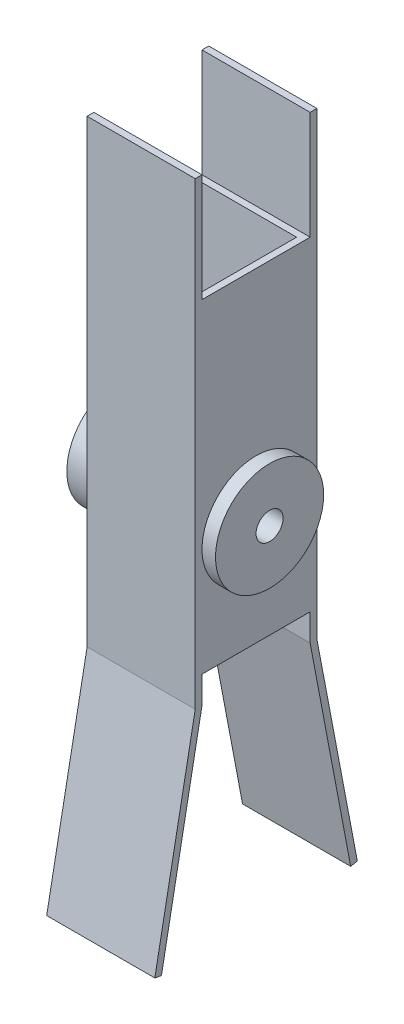
ISO-10303-21;
HEADER;
FILE_DESCRIPTION(('STEP AP214'),'2;1');
FILE_NAME('part.step','',(''),(''),'','','');
FILE_SCHEMA(('AUTOMOTIVE_DESIGN { 1 0 10303 214 1 1 1 1 }'));
ENDSEC;
DATA;
#1=APPLICATION_CONTEXT('core data for automotive mechanical design processes');
#2=APPLICATION_PROTOCOL_DEFINITION('international standard','automotive_design',2000,#1);
#3=PRODUCT_CONTEXT('',#1,'mechanical');
#4=PRODUCT('Part','Part','',(#3));
#5=PRODUCT_RELATED_PRODUCT_CATEGORY('part','',(#4));
#6=PRODUCT_DEFINITION_FORMATION('','',#4);
#7=PRODUCT_DEFINITION_CONTEXT('part definition',#1,'design');
#8=PRODUCT_DEFINITION('design','',#6,#7);
#9=PRODUCT_DEFINITION_SHAPE('','',#8);
#10=(LENGTH_UNIT() NAMED_UNIT(*) SI_UNIT(.MILLI.,.METRE.));
#11=(NAMED_UNIT(*) PLANE_ANGLE_UNIT() SI_UNIT($,.RADIAN.));
#12=(NAMED_UNIT(*) SI_UNIT($,.STERADIAN.) SOLID_ANGLE_UNIT());
#13=UNCERTAINTY_MEASURE_WITH_UNIT(LENGTH_MEASURE(1.E-05),#10,'distance_accuracy_value','');
#14=(GEOMETRIC_REPRESENTATION_CONTEXT(3) GLOBAL_UNCERTAINTY_ASSIGNED_CONTEXT((#13)) GLOBAL_UNIT_ASSIGNED_CONTEXT((#10,
#11,#12)) REPRESENTATION_CONTEXT('',''));
#15=CARTESIAN_POINT('',(0.,0.,0.));
#16=DIRECTION('',(0.,0.,1.));
#17=DIRECTION('',(1.,0.,0.));
#18=AXIS2_PLACEMENT_3D('',#15,#16,#17);
#19=CARTESIAN_POINT('',(1.5875,-94.6502778847388,11.1125));
#20=DIRECTION('',(-1.,0.,0.));
#21=DIRECTION('',(0.,0.,1.));
#22=AXIS2_PLACEMENT_3D('',#19,#20,#21);
#23=PLANE('',#22);
#24=DIRECTION('',(0.,1.,0.));
#25=VECTOR('',#24,1.);
#26=CARTESIAN_POINT('',(1.5875,-94.6502778847388,11.1125));
#27=LINE('',#26,#25);
#28=CARTESIAN_POINT('',(1.5875,-6.55163893789573,11.1125));
#29=VERTEX_POINT('',#28);
#30=CARTESIAN_POINT('',(1.5875,38.1,11.1125));
#31=VERTEX_POINT('',#30);
#32=EDGE_CURVE('E222',#29,#31,#27,.T.);
#33=ORIENTED_EDGE('',*,*,#32,.F.);
#34=CARTESIAN_POINT('',(1.5875,-12.7,0.));
#35=DIRECTION('',(-1.,0.,0.));
#36=DIRECTION('',(0.,0.,1.));
#37=AXIS2_PLACEMENT_3D('',#34,#35,#36);
#38=CIRCLE('',#37,12.7);
#39=CARTESIAN_POINT('',(1.5875,-6.55163893789573,-11.1125));
#40=VERTEX_POINT('',#39);
#41=EDGE_CURVE('E59',#29,#40,#38,.T.);
#42=ORIENTED_EDGE('',*,*,#41,.T.);
#43=DIRECTION('',(0.,1.,0.));
#44=VECTOR('',#43,1.);
#45=CARTESIAN_POINT('',(1.5875,-94.6502778847388,-11.1125));
#46=LINE('',#45,#44);
#47=CARTESIAN_POINT('',(1.5875,38.1,-11.1125));
#48=VERTEX_POINT('',#47);
#49=EDGE_CURVE('E467',#40,#48,#46,.T.);
#50=ORIENTED_EDGE('',*,*,#49,.T.);
#51=DIRECTION('',(0.,0.,1.));
#52=VECTOR('',#51,1.);
#53=CARTESIAN_POINT('',(1.5875,38.1,11.1125));
#54=LINE('',#53,#52);
#55=EDGE_CURVE('E475',#48,#31,#54,.T.);
#56=ORIENTED_EDGE('',*,*,#55,.T.);
#57=EDGE_LOOP('',(#33,#42,#50,#56));
#58=FACE_BOUND('',#57,.T.);
#59=ADVANCED_FACE('F35',(#58),#23,.F.);
#60=CARTESIAN_POINT('',(23.8125,-94.6502778847388,-11.1125));
#61=DIRECTION('',(0.,0.,-1.));
#62=DIRECTION('',(-1.,0.,0.));
#63=AXIS2_PLACEMENT_3D('',#60,#61,#62);
#64=PLANE('',#63);
#65=ORIENTED_EDGE('',*,*,#49,.F.);
#66=DIRECTION('',(1.,0.,0.));
#67=VECTOR('',#66,1.);
#68=CARTESIAN_POINT('',(-6.35,-6.55163893789573,-11.1125));
#69=LINE('',#68,#67);
#70=CARTESIAN_POINT('',(23.8125,-6.55163893789573,-11.1125));
#71=VERTEX_POINT('',#70);
#72=EDGE_CURVE('E210',#40,#71,#69,.T.);
#73=ORIENTED_EDGE('',*,*,#72,.T.);
#74=DIRECTION('',(0.,1.,0.));
#75=VECTOR('',#74,1.);
#76=CARTESIAN_POINT('',(23.8125,-94.6502778847388,-11.1125));
#77=LINE('',#76,#75);
#78=CARTESIAN_POINT('',(23.8125,38.1,-11.1125));
#79=VERTEX_POINT('',#78);
#80=EDGE_CURVE('E209',#71,#79,#77,.T.);
#81=ORIENTED_EDGE('',*,*,#80,.T.);
#82=DIRECTION('',(-1.,0.,0.));
#83=VECTOR('',#82,1.);
#84=CARTESIAN_POINT('',(23.8125,38.1,-11.1125));
#85=LINE('',#84,#83);
#86=EDGE_CURVE('E469',#79,#48,#85,.T.);
#87=ORIENTED_EDGE('',*,*,#86,.T.);
#88=EDGE_LOOP('',(#65,#73,#81,#87));
#89=FACE_BOUND('',#88,.T.);
#90=ADVANCED_FACE('F439',(#89),#64,.F.);
#91=CARTESIAN_POINT('',(23.8125,-94.6502778847388,11.1125));
#92=DIRECTION('',(1.,0.,0.));
#93=DIRECTION('',(0.,0.,-1.));
#94=AXIS2_PLACEMENT_3D('',#91,#92,#93);
#95=PLANE('',#94);
#96=ORIENTED_EDGE('',*,*,#80,.F.);
#97=CARTESIAN_POINT('',(23.8125,-12.7,0.));
#98=DIRECTION('',(1.,0.,0.));
#99=DIRECTION('',(0.,0.,-1.));
#100=AXIS2_PLACEMENT_3D('',#97,#98,#99);
#101=CIRCLE('',#100,12.7);
#102=CARTESIAN_POINT('',(23.8125,-6.55163893789574,11.1125));
#103=VERTEX_POINT('',#102);
#104=EDGE_CURVE('E197',#71,#103,#101,.T.);
#105=ORIENTED_EDGE('',*,*,#104,.T.);
#106=DIRECTION('',(0.,1.,0.));
#107=VECTOR('',#106,1.);
#108=CARTESIAN_POINT('',(23.8125,-94.6502778847388,11.1125));
#109=LINE('',#108,#107);
#110=CARTESIAN_POINT('',(23.8125,38.1,11.1125));
#111=VERTEX_POINT('',#110);
#112=EDGE_CURVE('E207',#103,#111,#109,.T.);
#113=ORIENTED_EDGE('',*,*,#112,.T.);
#114=DIRECTION('',(0.,0.,-1.));
#115=VECTOR('',#114,1.);
#116=CARTESIAN_POINT('',(23.8125,38.1,11.1125));
#117=LINE('',#116,#115);
#118=EDGE_CURVE('E472',#111,#79,#117,.T.);
#119=ORIENTED_EDGE('',*,*,#118,.T.);
#120=EDGE_LOOP('',(#96,#105,#113,#119));
#121=FACE_BOUND('',#120,.T.);
#122=ADVANCED_FACE('F205',(#121),#95,.F.);
#123=CARTESIAN_POINT('',(23.8125,-94.6502778847388,11.1125));
#124=DIRECTION('',(0.,0.,1.));
#125=DIRECTION('',(1.,0.,0.));
#126=AXIS2_PLACEMENT_3D('',#123,#124,#125);
#127=PLANE('',#126);
#128=CARTESIAN_POINT('',(1.5875,-38.1,11.1125));
#129=VERTEX_POINT('',#128);
#130=CARTESIAN_POINT('',(1.5875,-18.8483610621043,11.1125));
#131=VERTEX_POINT('',#130);
#132=EDGE_CURVE('E218',#129,#131,#27,.T.);
#133=ORIENTED_EDGE('',*,*,#132,.T.);
#134=DIRECTION('',(1.,0.,0.));
#135=VECTOR('',#134,1.);
#136=CARTESIAN_POINT('',(-6.35,-18.8483610621043,11.1125));
#137=LINE('',#136,#135);
#138=CARTESIAN_POINT('',(23.8125,-18.8483610621042,11.1125));
#139=VERTEX_POINT('',#138);
#140=EDGE_CURVE('E39',#131,#139,#137,.T.);
#141=ORIENTED_EDGE('',*,*,#140,.T.);
#142=CARTESIAN_POINT('',(23.8125,-38.1,11.1125));
#143=VERTEX_POINT('',#142);
#144=EDGE_CURVE('E217',#143,#139,#109,.T.);
#145=ORIENTED_EDGE('',*,*,#144,.F.);
#146=DIRECTION('',(1.,0.,0.));
#147=VECTOR('',#146,1.);
#148=CARTESIAN_POINT('',(25.4,-38.1,11.1125));
#149=LINE('',#148,#147);
#150=EDGE_CURVE('E228',#129,#143,#149,.T.);
#151=ORIENTED_EDGE('',*,*,#150,.F.);
#152=EDGE_LOOP('',(#133,#141,#145,#151));
#153=FACE_BOUND('',#152,.T.);
#154=ADVANCED_FACE('F528',(#153),#127,.F.);
#155=CARTESIAN_POINT('',(25.4,-38.1,0.));
#156=DIRECTION('',(0.,1.,0.));
#157=DIRECTION('',(0.,0.,1.));
#158=AXIS2_PLACEMENT_3D('',#155,#156,#157);
#159=PLANE('',#158);
#160=DIRECTION('',(-1.,0.,0.));
#161=VECTOR('',#160,1.);
#162=CARTESIAN_POINT('',(25.4,-38.1,-11.1125));
#163=LINE('',#162,#161);
#164=CARTESIAN_POINT('',(23.8125,-38.1,-11.1125));
#165=VERTEX_POINT('',#164);
#166=CARTESIAN_POINT('',(1.5875,-38.1,-11.1125));
#167=VERTEX_POINT('',#166);
#168=EDGE_CURVE('E235',#165,#167,#163,.T.);
#169=ORIENTED_EDGE('',*,*,#168,.T.);
#170=DIRECTION('',(0.,0.,1.));
#171=VECTOR('',#170,1.);
#172=CARTESIAN_POINT('',(1.5875,-38.1,0.));
#173=LINE('',#172,#171);
#174=EDGE_CURVE('E238',#167,#129,#173,.T.);
#175=ORIENTED_EDGE('',*,*,#174,.T.);
#176=ORIENTED_EDGE('',*,*,#150,.T.);
#177=DIRECTION('',(0.,0.,-1.));
#178=VECTOR('',#177,1.);
#179=CARTESIAN_POINT('',(23.8125,-38.1,0.));
#180=LINE('',#179,#178);
#181=EDGE_CURVE('E231',#143,#165,#180,.T.);
#182=ORIENTED_EDGE('',*,*,#181,.T.);
#183=EDGE_LOOP('',(#169,#175,#176,#182));
#184=FACE_BOUND('',#183,.T.);
#185=DIRECTION('',(0.,0.,-1.));
#186=VECTOR('',#185,1.);
#187=CARTESIAN_POINT('',(0.,-38.1,0.));
#188=LINE('',#187,#186);
#189=CARTESIAN_POINT('',(0.,-38.1,12.7));
#190=VERTEX_POINT('',#189);
#191=CARTESIAN_POINT('',(0.,-38.1,-12.7));
#192=VERTEX_POINT('',#191);
#193=EDGE_CURVE('E241',#190,#192,#188,.T.);
#194=ORIENTED_EDGE('',*,*,#193,.T.);
#195=DIRECTION('',(-1.,0.,0.));
#196=VECTOR('',#195,1.);
#197=CARTESIAN_POINT('',(25.4,-38.1,-12.7));
#198=LINE('',#197,#196);
#199=CARTESIAN_POINT('',(25.4,-38.1,-12.7));
#200=VERTEX_POINT('',#199);
#201=EDGE_CURVE('E202',#200,#192,#198,.T.);
#202=ORIENTED_EDGE('',*,*,#201,.F.);
#203=DIRECTION('',(0.,0.,-1.));
#204=VECTOR('',#203,1.);
#205=CARTESIAN_POINT('',(25.4,-38.1,0.));
#206=LINE('',#205,#204);
#207=CARTESIAN_POINT('',(25.4,-38.1,12.7));
#208=VERTEX_POINT('',#207);
#209=EDGE_CURVE('E242',#208,#200,#206,.T.);
#210=ORIENTED_EDGE('',*,*,#209,.F.);
#211=DIRECTION('',(-1.,0.,0.));
#212=VECTOR('',#211,1.);
#213=CARTESIAN_POINT('',(25.4,-38.1,12.7));
#214=LINE('',#213,#212);
#215=EDGE_CURVE('E319',#208,#190,#214,.T.);
#216=ORIENTED_EDGE('',*,*,#215,.T.);
#217=EDGE_LOOP('',(#194,#202,#210,#216));
#218=FACE_BOUND('',#217,.T.);
#219=ADVANCED_FACE('F37',(#184,#218),#159,.F.);
#220=CARTESIAN_POINT('',(25.4,0.,-12.7));
#221=DIRECTION('',(0.,0.,-1.));
#222=DIRECTION('',(0.,1.,0.));
#223=AXIS2_PLACEMENT_3D('',#220,#221,#222);
#224=PLANE('',#223);
#225=DIRECTION('',(0.,-1.,0.));
#226=VECTOR('',#225,1.);
#227=CARTESIAN_POINT('',(0.,0.,-12.7));
#228=LINE('',#227,#226);
#229=CARTESIAN_POINT('',(0.,-44.45,-12.7));
#230=VERTEX_POINT('',#229);
#231=EDGE_CURVE('E283',#192,#230,#228,.T.);
#232=ORIENTED_EDGE('',*,*,#231,.T.);
#233=DIRECTION('',(-1.,0.,0.));
#234=VECTOR('',#233,1.);
#235=CARTESIAN_POINT('',(25.4,-44.45,-12.7));
#236=LINE('',#235,#234);
#237=CARTESIAN_POINT('',(25.4,-44.45,-12.7));
#238=VERTEX_POINT('',#237);
#239=EDGE_CURVE('E350',#238,#230,#236,.T.);
#240=ORIENTED_EDGE('',*,*,#239,.F.);
#241=DIRECTION('',(0.,-1.,0.));
#242=VECTOR('',#241,1.);
#243=CARTESIAN_POINT('',(25.4,0.,-12.7));
#244=LINE('',#243,#242);
#245=EDGE_CURVE('E245',#200,#238,#244,.T.);
#246=ORIENTED_EDGE('',*,*,#245,.F.);
#247=ORIENTED_EDGE('',*,*,#201,.T.);
#248=EDGE_LOOP('',(#232,#240,#246,#247));
#249=FACE_BOUND('',#248,.T.);
#250=ADVANCED_FACE('F356',(#249),#224,.F.);
#251=CARTESIAN_POINT('',(25.4,0.781313445306878,-4.11781124089113));
#252=DIRECTION('',(0.,0.186414083883813,-0.982471266414321));
#253=DIRECTION('',(0.,0.982471266414321,0.186414083883813));
#254=AXIS2_PLACEMENT_3D('',#251,#252,#253);
#255=PLANE('',#254);
#256=DIRECTION('',(0.,-0.982471266414321,-0.186414083883813));
#257=VECTOR('',#256,1.);
#258=CARTESIAN_POINT('',(0.,0.781313445306878,-4.11781124089113));
#259=LINE('',#258,#257);
#260=CARTESIAN_POINT('',(0.,-94.6502778847388,-22.225));
#261=VERTEX_POINT('',#260);
#262=EDGE_CURVE('E285',#230,#261,#259,.T.);
#263=ORIENTED_EDGE('',*,*,#262,.T.);
#264=DIRECTION('',(-1.,0.,0.));
#265=VECTOR('',#264,1.);
#266=CARTESIAN_POINT('',(25.4,-94.6502778847388,-22.225));
#267=LINE('',#266,#265);
#268=CARTESIAN_POINT('',(25.4,-94.6502778847388,-22.225));
#269=VERTEX_POINT('',#268);
#270=EDGE_CURVE('E347',#269,#261,#267,.T.);
#271=ORIENTED_EDGE('',*,*,#270,.F.);
#272=DIRECTION('',(0.,-0.982471266414321,-0.186414083883813));
#273=VECTOR('',#272,1.);
#274=CARTESIAN_POINT('',(25.4,0.781313445306878,-4.11781124089113));
#275=LINE('',#274,#273);
#276=EDGE_CURVE('E248',#238,#269,#275,.T.);
#277=ORIENTED_EDGE('',*,*,#276,.F.);
#278=ORIENTED_EDGE('',*,*,#239,.T.);
#279=EDGE_LOOP('',(#263,#271,#277,#278));
#280=FACE_BOUND('',#279,.T.);
#281=ADVANCED_FACE('F425',(#280),#255,.F.);
#282=CARTESIAN_POINT('',(25.4,-95.4315913300458,-18.1071887591079));
#283=DIRECTION('',(0.,0.982471266414322,0.186414083883803));
#284=DIRECTION('',(0.,-0.186414083883803,0.982471266414323));
#285=AXIS2_PLACEMENT_3D('',#282,#283,#284);
#286=PLANE('',#285);
#287=DIRECTION('',(0.,0.186414083883803,-0.982471266414323));
#288=VECTOR('',#287,1.);
#289=CARTESIAN_POINT('',(0.,-95.4315913300458,-18.1071887591079));
#290=LINE('',#289,#288);
#291=CARTESIAN_POINT('',(0.,-94.3543455265733,-23.7846731354327));
#292=VERTEX_POINT('',#291);
#293=EDGE_CURVE('E288',#261,#292,#290,.T.);
#294=ORIENTED_EDGE('',*,*,#293,.T.);
#295=DIRECTION('',(-1.,0.,0.));
#296=VECTOR('',#295,1.);
#297=CARTESIAN_POINT('',(25.4,-94.3543455265733,-23.7846731354327));
#298=LINE('',#297,#296);
#299=CARTESIAN_POINT('',(25.4,-94.3543455265733,-23.7846731354327));
#300=VERTEX_POINT('',#299);
#301=EDGE_CURVE('E344',#300,#292,#298,.T.);
#302=ORIENTED_EDGE('',*,*,#301,.F.);
#303=DIRECTION('',(0.,0.186414083883803,-0.982471266414323));
#304=VECTOR('',#303,1.);
#305=CARTESIAN_POINT('',(25.4,-95.4315913300458,-18.1071887591079));
#306=LINE('',#305,#304);
#307=EDGE_CURVE('E251',#269,#300,#306,.T.);
#308=ORIENTED_EDGE('',*,*,#307,.F.);
#309=ORIENTED_EDGE('',*,*,#270,.T.);
#310=EDGE_LOOP('',(#294,#302,#308,#309));
#311=FACE_BOUND('',#310,.T.);
#312=ADVANCED_FACE('F421',(#311),#286,.F.);
#313=CARTESIAN_POINT('',(25.4,1.07040819099664,-5.62462318589043));
#314=DIRECTION('',(0.,-0.186952227075447,0.982369006428608));
#315=DIRECTION('',(0.,-0.982369006428608,-0.186952227075447));
#316=AXIS2_PLACEMENT_3D('',#313,#314,#315);
#317=PLANE('',#316);
#318=DIRECTION('',(0.,0.982369006428608,0.186952227075447));
#319=VECTOR('',#318,1.);
#320=CARTESIAN_POINT('',(0.,1.07040819099664,-5.62462318589043));
#321=LINE('',#320,#319);
#322=CARTESIAN_POINT('',(0.,-44.45,-14.2875));
#323=VERTEX_POINT('',#322);
#324=EDGE_CURVE('E290',#292,#323,#321,.T.);
#325=ORIENTED_EDGE('',*,*,#324,.T.);
#326=DIRECTION('',(-1.,0.,0.));
#327=VECTOR('',#326,1.);
#328=CARTESIAN_POINT('',(25.4,-44.45,-14.2875));
#329=LINE('',#328,#327);
#330=CARTESIAN_POINT('',(25.4,-44.45,-14.2875));
#331=VERTEX_POINT('',#330);
#332=EDGE_CURVE('E342',#331,#323,#329,.T.);
#333=ORIENTED_EDGE('',*,*,#332,.F.);
#334=DIRECTION('',(0.,0.982369006428608,0.186952227075447));
#335=VECTOR('',#334,1.);
#336=CARTESIAN_POINT('',(25.4,1.07040819099664,-5.62462318589043));
#337=LINE('',#336,#335);
#338=EDGE_CURVE('E253',#300,#331,#337,.T.);
#339=ORIENTED_EDGE('',*,*,#338,.F.);
#340=ORIENTED_EDGE('',*,*,#301,.T.);
#341=EDGE_LOOP('',(#325,#333,#339,#340));
#342=FACE_BOUND('',#341,.T.);
#343=ADVANCED_FACE('F416',(#342),#317,.F.);
#344=CARTESIAN_POINT('',(25.4,0.,-14.2875));
#345=DIRECTION('',(0.,0.,-1.));
#346=DIRECTION('',(0.,1.,0.));
#347=AXIS2_PLACEMENT_3D('',#344,#345,#346);
#348=PLANE('',#347);
#349=DIRECTION('',(0.,-1.,0.));
#350=VECTOR('',#349,1.);
#351=CARTESIAN_POINT('',(0.,0.,-14.2875));
#352=LINE('',#351,#350);
#353=CARTESIAN_POINT('',(0.,63.5,-14.2875));
#354=VERTEX_POINT('',#353);
#355=EDGE_CURVE('E293',#354,#323,#352,.T.);
#356=ORIENTED_EDGE('',*,*,#355,.F.);
#357=DIRECTION('',(-1.,0.,0.));
#358=VECTOR('',#357,1.);
#359=CARTESIAN_POINT('',(25.4,63.5,-14.2875));
#360=LINE('',#359,#358);
#361=CARTESIAN_POINT('',(25.4,63.5,-14.2875));
#362=VERTEX_POINT('',#361);
#363=EDGE_CURVE('E340',#362,#354,#360,.T.);
#364=ORIENTED_EDGE('',*,*,#363,.F.);
#365=DIRECTION('',(0.,-1.,0.));
#366=VECTOR('',#365,1.);
#367=CARTESIAN_POINT('',(25.4,0.,-14.2875));
#368=LINE('',#367,#366);
#369=EDGE_CURVE('E255',#362,#331,#368,.T.);
#370=ORIENTED_EDGE('',*,*,#369,.T.);
#371=ORIENTED_EDGE('',*,*,#332,.T.);
#372=EDGE_LOOP('',(#356,#364,#370,#371));
#373=FACE_BOUND('',#372,.T.);
#374=ADVANCED_FACE('F411',(#373),#348,.T.);
#375=CARTESIAN_POINT('',(25.4,63.5,0.));
#376=DIRECTION('',(0.,1.,0.));
#377=DIRECTION('',(0.,0.,1.));
#378=AXIS2_PLACEMENT_3D('',#375,#376,#377);
#379=PLANE('',#378);
#380=DIRECTION('',(0.,0.,-1.));
#381=VECTOR('',#380,1.);
#382=CARTESIAN_POINT('',(0.,63.5,0.));
#383=LINE('',#382,#381);
#384=CARTESIAN_POINT('',(0.,63.5,-12.7));
#385=VERTEX_POINT('',#384);
#386=EDGE_CURVE('E296',#385,#354,#383,.T.);
#387=ORIENTED_EDGE('',*,*,#386,.F.);
#388=DIRECTION('',(-1.,0.,0.));
#389=VECTOR('',#388,1.);
#390=CARTESIAN_POINT('',(25.4,63.5,-12.7));
#391=LINE('',#390,#389);
#392=CARTESIAN_POINT('',(25.4,63.5,-12.7));
#393=VERTEX_POINT('',#392);
#394=EDGE_CURVE('E338',#393,#385,#391,.T.);
#395=ORIENTED_EDGE('',*,*,#394,.F.);
#396=DIRECTION('',(0.,0.,-1.));
#397=VECTOR('',#396,1.);
#398=CARTESIAN_POINT('',(25.4,63.5,0.));
#399=LINE('',#398,#397);
#400=EDGE_CURVE('E258',#393,#362,#399,.T.);
#401=ORIENTED_EDGE('',*,*,#400,.T.);
#402=ORIENTED_EDGE('',*,*,#363,.T.);
#403=EDGE_LOOP('',(#387,#395,#401,#402));
#404=FACE_BOUND('',#403,.T.);
#405=ADVANCED_FACE('F405',(#404),#379,.T.);
#406=CARTESIAN_POINT('',(0.,38.1,-12.7));
#407=VERTEX_POINT('',#406);
#408=EDGE_CURVE('E286',#385,#407,#228,.T.);
#409=ORIENTED_EDGE('',*,*,#408,.T.);
#410=DIRECTION('',(-1.,0.,0.));
#411=VECTOR('',#410,1.);
#412=CARTESIAN_POINT('',(25.4,38.1,-12.7));
#413=LINE('',#412,#411);
#414=CARTESIAN_POINT('',(25.4,38.1,-12.7));
#415=VERTEX_POINT('',#414);
#416=EDGE_CURVE('E336',#415,#407,#413,.T.);
#417=ORIENTED_EDGE('',*,*,#416,.F.);
#418=EDGE_CURVE('E249',#393,#415,#244,.T.);
#419=ORIENTED_EDGE('',*,*,#418,.F.);
#420=ORIENTED_EDGE('',*,*,#394,.T.);
#421=EDGE_LOOP('',(#409,#417,#419,#420));
#422=FACE_BOUND('',#421,.T.);
#423=ADVANCED_FACE('F549',(#422),#224,.F.);
#424=CARTESIAN_POINT('',(25.4,38.1,0.));
#425=DIRECTION('',(0.,1.,0.));
#426=DIRECTION('',(0.,0.,1.));
#427=AXIS2_PLACEMENT_3D('',#424,#425,#426);
#428=PLANE('',#427);
#429=ORIENTED_EDGE('',*,*,#55,.F.);
#430=ORIENTED_EDGE('',*,*,#86,.F.);
#431=ORIENTED_EDGE('',*,*,#118,.F.);
#432=DIRECTION('',(1.,0.,0.));
#433=VECTOR('',#432,1.);
#434=CARTESIAN_POINT('',(23.8125,38.1,11.1125));
#435=LINE('',#434,#433);
#436=EDGE_CURVE('E215',#31,#111,#435,.T.);
#437=ORIENTED_EDGE('',*,*,#436,.F.);
#438=EDGE_LOOP('',(#429,#430,#431,#437));
#439=FACE_BOUND('',#438,.T.);
#440=DIRECTION('',(0.,0.,-1.));
#441=VECTOR('',#440,1.);
#442=CARTESIAN_POINT('',(0.,38.1,0.));
#443=LINE('',#442,#441);
#444=CARTESIAN_POINT('',(0.,38.1,12.7));
#445=VERTEX_POINT('',#444);
#446=EDGE_CURVE('E299',#445,#407,#443,.T.);
#447=ORIENTED_EDGE('',*,*,#446,.F.);
#448=DIRECTION('',(-1.,0.,0.));
#449=VECTOR('',#448,1.);
#450=CARTESIAN_POINT('',(25.4,38.1,12.7));
#451=LINE('',#450,#449);
#452=CARTESIAN_POINT('',(25.4,38.1,12.7));
#453=VERTEX_POINT('',#452);
#454=EDGE_CURVE('E334',#453,#445,#451,.T.);
#455=ORIENTED_EDGE('',*,*,#454,.F.);
#456=DIRECTION('',(0.,0.,-1.));
#457=VECTOR('',#456,1.);
#458=CARTESIAN_POINT('',(25.4,38.1,0.));
#459=LINE('',#458,#457);
#460=EDGE_CURVE('E261',#453,#415,#459,.T.);
#461=ORIENTED_EDGE('',*,*,#460,.T.);
#462=ORIENTED_EDGE('',*,*,#416,.T.);
#463=EDGE_LOOP('',(#447,#455,#461,#462));
#464=FACE_BOUND('',#463,.T.);
#465=ADVANCED_FACE('F398',(#439,#464),#428,.T.);
#466=CARTESIAN_POINT('',(25.4,0.,12.7));
#467=DIRECTION('',(0.,0.,-1.));
#468=DIRECTION('',(0.,1.,0.));
#469=AXIS2_PLACEMENT_3D('',#466,#467,#468);
#470=PLANE('',#469);
#471=DIRECTION('',(0.,-1.,0.));
#472=VECTOR('',#471,1.);
#473=CARTESIAN_POINT('',(0.,0.,12.7));
#474=LINE('',#473,#472);
#475=CARTESIAN_POINT('',(0.,63.5,12.7));
#476=VERTEX_POINT('',#475);
#477=EDGE_CURVE('E302',#476,#445,#474,.T.);
#478=ORIENTED_EDGE('',*,*,#477,.F.);
#479=DIRECTION('',(-1.,0.,0.));
#480=VECTOR('',#479,1.);
#481=CARTESIAN_POINT('',(25.4,63.5,12.7));
#482=LINE('',#481,#480);
#483=CARTESIAN_POINT('',(25.4,63.5,12.7));
#484=VERTEX_POINT('',#483);
#485=EDGE_CURVE('E332',#484,#476,#482,.T.);
#486=ORIENTED_EDGE('',*,*,#485,.F.);
#487=DIRECTION('',(0.,-1.,0.));
#488=VECTOR('',#487,1.);
#489=CARTESIAN_POINT('',(25.4,0.,12.7));
#490=LINE('',#489,#488);
#491=EDGE_CURVE('E264',#484,#453,#490,.T.);
#492=ORIENTED_EDGE('',*,*,#491,.T.);
#493=ORIENTED_EDGE('',*,*,#454,.T.);
#494=EDGE_LOOP('',(#478,#486,#492,#493));
#495=FACE_BOUND('',#494,.T.);
#496=ADVANCED_FACE('F392',(#495),#470,.T.);
#497=CARTESIAN_POINT('',(25.4,63.5,0.));
#498=DIRECTION('',(0.,-1.,0.));
#499=DIRECTION('',(0.,0.,-1.));
#500=AXIS2_PLACEMENT_3D('',#497,#498,#499);
#501=PLANE('',#500);
#502=DIRECTION('',(0.,0.,1.));
#503=VECTOR('',#502,1.);
#504=CARTESIAN_POINT('',(0.,63.5,0.));
#505=LINE('',#504,#503);
#506=CARTESIAN_POINT('',(0.,63.5,14.2875));
#507=VERTEX_POINT('',#506);
#508=EDGE_CURVE('E305',#476,#507,#505,.T.);
#509=ORIENTED_EDGE('',*,*,#508,.T.);
#510=DIRECTION('',(-1.,0.,0.));
#511=VECTOR('',#510,1.);
#512=CARTESIAN_POINT('',(25.4,63.5,14.2875));
#513=LINE('',#512,#511);
#514=CARTESIAN_POINT('',(25.4,63.5,14.2875));
#515=VERTEX_POINT('',#514);
#516=EDGE_CURVE('E329',#515,#507,#513,.T.);
#517=ORIENTED_EDGE('',*,*,#516,.F.);
#518=DIRECTION('',(0.,0.,1.));
#519=VECTOR('',#518,1.);
#520=CARTESIAN_POINT('',(25.4,63.5,0.));
#521=LINE('',#520,#519);
#522=EDGE_CURVE('E267',#484,#515,#521,.T.);
#523=ORIENTED_EDGE('',*,*,#522,.F.);
#524=ORIENTED_EDGE('',*,*,#485,.T.);
#525=EDGE_LOOP('',(#509,#517,#523,#524));
#526=FACE_BOUND('',#525,.T.);
#527=ADVANCED_FACE('F428',(#526),#501,.F.);
#528=CARTESIAN_POINT('',(25.4,0.,14.2875));
#529=DIRECTION('',(0.,0.,-1.));
#530=DIRECTION('',(0.,1.,0.));
#531=AXIS2_PLACEMENT_3D('',#528,#529,#530);
#532=PLANE('',#531);
#533=DIRECTION('',(0.,-1.,0.));
#534=VECTOR('',#533,1.);
#535=CARTESIAN_POINT('',(0.,0.,14.2875));
#536=LINE('',#535,#534);
#537=CARTESIAN_POINT('',(0.,-44.45,14.2875));
#538=VERTEX_POINT('',#537);
#539=EDGE_CURVE('E307',#507,#538,#536,.T.);
#540=ORIENTED_EDGE('',*,*,#539,.T.);
#541=DIRECTION('',(-1.,0.,0.));
#542=VECTOR('',#541,1.);
#543=CARTESIAN_POINT('',(25.4,-44.45,14.2875));
#544=LINE('',#543,#542);
#545=CARTESIAN_POINT('',(25.4,-44.45,14.2875));
#546=VERTEX_POINT('',#545);
#547=EDGE_CURVE('E327',#546,#538,#544,.T.);
#548=ORIENTED_EDGE('',*,*,#547,.F.);
#549=DIRECTION('',(0.,-1.,0.));
#550=VECTOR('',#549,1.);
#551=CARTESIAN_POINT('',(25.4,0.,14.2875));
#552=LINE('',#551,#550);
#553=EDGE_CURVE('E270',#515,#546,#552,.T.);
#554=ORIENTED_EDGE('',*,*,#553,.F.);
#555=ORIENTED_EDGE('',*,*,#516,.T.);
#556=EDGE_LOOP('',(#540,#548,#554,#555));
#557=FACE_BOUND('',#556,.T.);
#558=ADVANCED_FACE('F386',(#557),#532,.F.);
#559=CARTESIAN_POINT('',(25.4,1.07040819099664,5.62462318589045));
#560=DIRECTION('',(0.,0.186952227075447,0.982369006428608));
#561=DIRECTION('',(0.,-0.982369006428608,0.186952227075447));
#562=AXIS2_PLACEMENT_3D('',#559,#560,#561);
#563=PLANE('',#562);
#564=DIRECTION('',(0.,0.982369006428608,-0.186952227075447));
#565=VECTOR('',#564,1.);
#566=CARTESIAN_POINT('',(0.,1.07040819099664,5.62462318589045));
#567=LINE('',#566,#565);
#568=CARTESIAN_POINT('',(0.,-94.3543455265733,23.7846731354327));
#569=VERTEX_POINT('',#568);
#570=EDGE_CURVE('E310',#569,#538,#567,.T.);
#571=ORIENTED_EDGE('',*,*,#570,.F.);
#572=DIRECTION('',(-1.,0.,0.));
#573=VECTOR('',#572,1.);
#574=CARTESIAN_POINT('',(25.4,-94.3543455265733,23.7846731354327));
#575=LINE('',#574,#573);
#576=CARTESIAN_POINT('',(25.4,-94.3543455265733,23.7846731354327));
#577=VERTEX_POINT('',#576);
#578=EDGE_CURVE('E325',#577,#569,#575,.T.);
#579=ORIENTED_EDGE('',*,*,#578,.F.);
#580=DIRECTION('',(0.,0.982369006428608,-0.186952227075447));
#581=VECTOR('',#580,1.);
#582=CARTESIAN_POINT('',(25.4,1.07040819099664,5.62462318589045));
#583=LINE('',#582,#581);
#584=EDGE_CURVE('E272',#577,#546,#583,.T.);
#585=ORIENTED_EDGE('',*,*,#584,.T.);
#586=ORIENTED_EDGE('',*,*,#547,.T.);
#587=EDGE_LOOP('',(#571,#579,#585,#586));
#588=FACE_BOUND('',#587,.T.);
#589=ADVANCED_FACE('F382',(#588),#563,.T.);
#590=CARTESIAN_POINT('',(25.4,-95.4315913300458,18.1071887591079));
#591=DIRECTION('',(0.,-0.982471266414322,0.186414083883802));
#592=DIRECTION('',(0.,-0.186414083883802,-0.982471266414323));
#593=AXIS2_PLACEMENT_3D('',#590,#591,#592);
#594=PLANE('',#593);
#595=DIRECTION('',(0.,0.186414083883802,0.982471266414323));
#596=VECTOR('',#595,1.);
#597=CARTESIAN_POINT('',(0.,-95.4315913300458,18.1071887591079));
#598=LINE('',#597,#596);
#599=CARTESIAN_POINT('',(0.,-94.6502778847388,22.225));
#600=VERTEX_POINT('',#599);
#601=EDGE_CURVE('E313',#600,#569,#598,.T.);
#602=ORIENTED_EDGE('',*,*,#601,.F.);
#603=DIRECTION('',(-1.,0.,0.));
#604=VECTOR('',#603,1.);
#605=CARTESIAN_POINT('',(25.4,-94.6502778847388,22.225));
#606=LINE('',#605,#604);
#607=CARTESIAN_POINT('',(25.4,-94.6502778847388,22.225));
#608=VERTEX_POINT('',#607);
#609=EDGE_CURVE('E323',#608,#600,#606,.T.);
#610=ORIENTED_EDGE('',*,*,#609,.F.);
#611=DIRECTION('',(0.,0.186414083883802,0.982471266414323));
#612=VECTOR('',#611,1.);
#613=CARTESIAN_POINT('',(25.4,-95.4315913300458,18.1071887591079));
#614=LINE('',#613,#612);
#615=EDGE_CURVE('E275',#608,#577,#614,.T.);
#616=ORIENTED_EDGE('',*,*,#615,.T.);
#617=ORIENTED_EDGE('',*,*,#578,.T.);
#618=EDGE_LOOP('',(#602,#610,#616,#617));
#619=FACE_BOUND('',#618,.T.);
#620=ADVANCED_FACE('F378',(#619),#594,.T.);
#621=CARTESIAN_POINT('',(25.4,0.781313445306882,4.11781124089116));
#622=DIRECTION('',(0.,-0.186414083883812,-0.982471266414321));
#623=DIRECTION('',(0.,0.982471266414321,-0.186414083883812));
#624=AXIS2_PLACEMENT_3D('',#621,#622,#623);
#625=PLANE('',#624);
#626=DIRECTION('',(0.,-0.982471266414321,0.186414083883812));
#627=VECTOR('',#626,1.);
#628=CARTESIAN_POINT('',(0.,0.781313445306882,4.11781124089116));
#629=LINE('',#628,#627);
#630=CARTESIAN_POINT('',(0.,-44.45,12.7));
#631=VERTEX_POINT('',#630);
#632=EDGE_CURVE('E316',#631,#600,#629,.T.);
#633=ORIENTED_EDGE('',*,*,#632,.F.);
#634=DIRECTION('',(-1.,0.,0.));
#635=VECTOR('',#634,1.);
#636=CARTESIAN_POINT('',(25.4,-44.45,12.7));
#637=LINE('',#636,#635);
#638=CARTESIAN_POINT('',(25.4,-44.45,12.7));
#639=VERTEX_POINT('',#638);
#640=EDGE_CURVE('E321',#639,#631,#637,.T.);
#641=ORIENTED_EDGE('',*,*,#640,.F.);
#642=DIRECTION('',(0.,-0.982471266414321,0.186414083883812));
#643=VECTOR('',#642,1.);
#644=CARTESIAN_POINT('',(25.4,0.781313445306882,4.11781124089116));
#645=LINE('',#644,#643);
#646=EDGE_CURVE('E278',#639,#608,#645,.T.);
#647=ORIENTED_EDGE('',*,*,#646,.T.);
#648=ORIENTED_EDGE('',*,*,#609,.T.);
#649=EDGE_LOOP('',(#633,#641,#647,#648));
#650=FACE_BOUND('',#649,.T.);
#651=ADVANCED_FACE('F373',(#650),#625,.T.);
#652=EDGE_CURVE('E246',#190,#631,#474,.T.);
#653=ORIENTED_EDGE('',*,*,#652,.F.);
#654=ORIENTED_EDGE('',*,*,#215,.F.);
#655=EDGE_CURVE('E268',#208,#639,#490,.T.);
#656=ORIENTED_EDGE('',*,*,#655,.T.);
#657=ORIENTED_EDGE('',*,*,#640,.T.);
#658=EDGE_LOOP('',(#653,#654,#656,#657));
#659=FACE_BOUND('',#658,.T.);
#660=ADVANCED_FACE('F367',(#659),#470,.T.);
#661=CARTESIAN_POINT('',(25.4,0.,0.));
#662=DIRECTION('',(1.,0.,0.));
#663=DIRECTION('',(0.,0.,-1.));
#664=AXIS2_PLACEMENT_3D('',#661,#662,#663);
#665=PLANE('',#664);
#666=CARTESIAN_POINT('',(25.4,-12.7,0.));
#667=DIRECTION('',(1.,0.,0.));
#668=DIRECTION('',(0.,0.,-1.));
#669=AXIS2_PLACEMENT_3D('',#666,#667,#668);
#670=CIRCLE('',#669,12.7);
#671=CARTESIAN_POINT('',(25.4,-12.7,-12.7));
#672=VERTEX_POINT('',#671);
#673=EDGE_CURVE('E11',#672,#672,#670,.T.);
#674=ORIENTED_EDGE('',*,*,#673,.F.);
#675=EDGE_LOOP('',(#674));
#676=FACE_BOUND('',#675,.T.);
#677=ORIENTED_EDGE('',*,*,#209,.T.);
#678=ORIENTED_EDGE('',*,*,#245,.T.);
#679=ORIENTED_EDGE('',*,*,#276,.T.);
#680=ORIENTED_EDGE('',*,*,#307,.T.);
#681=ORIENTED_EDGE('',*,*,#338,.T.);
#682=ORIENTED_EDGE('',*,*,#369,.F.);
#683=ORIENTED_EDGE('',*,*,#400,.F.);
#684=ORIENTED_EDGE('',*,*,#418,.T.);
#685=ORIENTED_EDGE('',*,*,#460,.F.);
#686=ORIENTED_EDGE('',*,*,#491,.F.);
#687=ORIENTED_EDGE('',*,*,#522,.T.);
#688=ORIENTED_EDGE('',*,*,#553,.T.);
#689=ORIENTED_EDGE('',*,*,#584,.F.);
#690=ORIENTED_EDGE('',*,*,#615,.F.);
#691=ORIENTED_EDGE('',*,*,#646,.F.);
#692=ORIENTED_EDGE('',*,*,#655,.F.);
#693=EDGE_LOOP('',(#677,#678,#679,#680,#681,#682,#683,#684,#685,#686,#687,#688,#689,#690,#691,#692));
#694=FACE_BOUND('',#693,.T.);
#695=ADVANCED_FACE('F427',(#676,#694),#665,.T.);
#696=CARTESIAN_POINT('',(0.,0.,0.));
#697=DIRECTION('',(1.,0.,0.));
#698=DIRECTION('',(0.,0.,-1.));
#699=AXIS2_PLACEMENT_3D('',#696,#697,#698);
#700=PLANE('',#699);
#701=CARTESIAN_POINT('',(0.,-12.7,0.));
#702=DIRECTION('',(1.,0.,0.));
#703=DIRECTION('',(0.,0.,-1.));
#704=AXIS2_PLACEMENT_3D('',#701,#702,#703);
#705=CIRCLE('',#704,12.7);
#706=CARTESIAN_POINT('',(0.,-12.7,-12.7));
#707=VERTEX_POINT('',#706);
#708=EDGE_CURVE('E477',#707,#707,#705,.T.);
#709=ORIENTED_EDGE('',*,*,#708,.T.);
#710=EDGE_LOOP('',(#709));
#711=FACE_BOUND('',#710,.T.);
#712=ORIENTED_EDGE('',*,*,#193,.F.);
#713=ORIENTED_EDGE('',*,*,#652,.T.);
#714=ORIENTED_EDGE('',*,*,#632,.T.);
#715=ORIENTED_EDGE('',*,*,#601,.T.);
#716=ORIENTED_EDGE('',*,*,#570,.T.);
#717=ORIENTED_EDGE('',*,*,#539,.F.);
#718=ORIENTED_EDGE('',*,*,#508,.F.);
#719=ORIENTED_EDGE('',*,*,#477,.T.);
#720=ORIENTED_EDGE('',*,*,#446,.T.);
#721=ORIENTED_EDGE('',*,*,#408,.F.);
#722=ORIENTED_EDGE('',*,*,#386,.T.);
#723=ORIENTED_EDGE('',*,*,#355,.T.);
#724=ORIENTED_EDGE('',*,*,#324,.F.);
#725=ORIENTED_EDGE('',*,*,#293,.F.);
#726=ORIENTED_EDGE('',*,*,#262,.F.);
#727=ORIENTED_EDGE('',*,*,#231,.F.);
#728=EDGE_LOOP('',(#712,#713,#714,#715,#716,#717,#718,#719,#720,#721,#722,#723,#724,#725,#726,#727));
#729=FACE_BOUND('',#728,.T.);
#730=ADVANCED_FACE('F364',(#711,#729),#700,.F.);
#731=CARTESIAN_POINT('',(1.5875,-18.8483610621043,-11.1125));
#732=VERTEX_POINT('',#731);
#733=EDGE_CURVE('E232',#167,#732,#46,.T.);
#734=ORIENTED_EDGE('',*,*,#733,.T.);
#735=EDGE_CURVE('E465',#732,#131,#38,.T.);
#736=ORIENTED_EDGE('',*,*,#735,.T.);
#737=ORIENTED_EDGE('',*,*,#132,.F.);
#738=ORIENTED_EDGE('',*,*,#174,.F.);
#739=EDGE_LOOP('',(#734,#736,#737,#738));
#740=FACE_BOUND('',#739,.T.);
#741=ADVANCED_FACE('F442',(#740),#23,.F.);
#742=CARTESIAN_POINT('',(23.8125,-18.8483610621043,-11.1125));
#743=VERTEX_POINT('',#742);
#744=EDGE_CURVE('E225',#165,#743,#77,.T.);
#745=ORIENTED_EDGE('',*,*,#744,.T.);
#746=DIRECTION('',(1.,0.,0.));
#747=VECTOR('',#746,1.);
#748=CARTESIAN_POINT('',(-6.35,-18.8483610621043,-11.1125));
#749=LINE('',#748,#747);
#750=EDGE_CURVE('E481',#743,#732,#749,.F.);
#751=ORIENTED_EDGE('',*,*,#750,.T.);
#752=ORIENTED_EDGE('',*,*,#733,.F.);
#753=ORIENTED_EDGE('',*,*,#168,.F.);
#754=EDGE_LOOP('',(#745,#751,#752,#753));
#755=FACE_BOUND('',#754,.T.);
#756=ADVANCED_FACE('F448',(#755),#64,.F.);
#757=ORIENTED_EDGE('',*,*,#144,.T.);
#758=EDGE_CURVE('E51',#139,#743,#101,.T.);
#759=ORIENTED_EDGE('',*,*,#758,.T.);
#760=ORIENTED_EDGE('',*,*,#744,.F.);
#761=ORIENTED_EDGE('',*,*,#181,.F.);
#762=EDGE_LOOP('',(#757,#759,#760,#761));
#763=FACE_BOUND('',#762,.T.);
#764=ADVANCED_FACE('F457',(#763),#95,.F.);
#765=ORIENTED_EDGE('',*,*,#112,.F.);
#766=DIRECTION('',(1.,0.,0.));
#767=VECTOR('',#766,1.);
#768=CARTESIAN_POINT('',(-6.35,-6.55163893789574,11.1125));
#769=LINE('',#768,#767);
#770=EDGE_CURVE('E194',#103,#29,#769,.F.);
#771=ORIENTED_EDGE('',*,*,#770,.T.);
#772=ORIENTED_EDGE('',*,*,#32,.T.);
#773=ORIENTED_EDGE('',*,*,#436,.T.);
#774=EDGE_LOOP('',(#765,#771,#772,#773));
#775=FACE_BOUND('',#774,.T.);
#776=ADVANCED_FACE('F213',(#775),#127,.F.);
#777=CARTESIAN_POINT('',(-6.35,-12.7,0.));
#778=DIRECTION('',(1.,0.,0.));
#779=DIRECTION('',(0.,0.,-1.));
#780=AXIS2_PLACEMENT_3D('',#777,#778,#779);
#781=CYLINDRICAL_SURFACE('',#780,12.7);
#782=ORIENTED_EDGE('',*,*,#41,.F.);
#783=ORIENTED_EDGE('',*,*,#770,.F.);
#784=ORIENTED_EDGE('',*,*,#104,.F.);
#785=ORIENTED_EDGE('',*,*,#72,.F.);
#786=EDGE_LOOP('',(#782,#783,#784,#785));
#787=FACE_BOUND('',#786,.T.);
#788=ADVANCED_FACE('F196',(#787),#781,.T.);
#789=ORIENTED_EDGE('',*,*,#735,.F.);
#790=ORIENTED_EDGE('',*,*,#750,.F.);
#791=ORIENTED_EDGE('',*,*,#758,.F.);
#792=ORIENTED_EDGE('',*,*,#140,.F.);
#793=EDGE_LOOP('',(#789,#790,#791,#792));
#794=FACE_BOUND('',#793,.T.);
#795=ADVANCED_FACE('F521',(#794),#781,.T.);
#796=CARTESIAN_POINT('',(-6.35,-12.7,0.));
#797=DIRECTION('',(1.,0.,0.));
#798=DIRECTION('',(0.,0.,-1.));
#799=AXIS2_PLACEMENT_3D('',#796,#797,#798);
#800=PLANE('',#799);
#801=CARTESIAN_POINT('',(-6.35,-12.7,0.));
#802=DIRECTION('',(1.,0.,0.));
#803=DIRECTION('',(0.,0.,-1.));
#804=AXIS2_PLACEMENT_3D('',#801,#802,#803);
#805=CIRCLE('',#804,3.175);
#806=CARTESIAN_POINT('',(-6.35,-12.7,-3.175));
#807=VERTEX_POINT('',#806);
#808=EDGE_CURVE('E490',#807,#807,#805,.T.);
#809=ORIENTED_EDGE('',*,*,#808,.T.);
#810=EDGE_LOOP('',(#809));
#811=FACE_BOUND('',#810,.T.);
#812=CARTESIAN_POINT('',(-6.35,-12.7,0.));
#813=DIRECTION('',(1.,0.,0.));
#814=DIRECTION('',(0.,0.,-1.));
#815=AXIS2_PLACEMENT_3D('',#812,#813,#814);
#816=CIRCLE('',#815,12.7);
#817=CARTESIAN_POINT('',(-6.35,-12.7,-12.7));
#818=VERTEX_POINT('',#817);
#819=EDGE_CURVE('E211',#818,#818,#816,.T.);
#820=ORIENTED_EDGE('',*,*,#819,.F.);
#821=EDGE_LOOP('',(#820));
#822=FACE_BOUND('',#821,.T.);
#823=ADVANCED_FACE('F497',(#811,#822),#800,.F.);
#824=ORIENTED_EDGE('',*,*,#819,.T.);
#825=EDGE_LOOP('',(#824));
#826=FACE_BOUND('',#825,.T.);
#827=ORIENTED_EDGE('',*,*,#708,.F.);
#828=EDGE_LOOP('',(#827));
#829=FACE_BOUND('',#828,.T.);
#830=ADVANCED_FACE('F514',(#826,#829),#781,.T.);
#831=ORIENTED_EDGE('',*,*,#673,.T.);
#832=EDGE_LOOP('',(#831));
#833=FACE_BOUND('',#832,.T.);
#834=CARTESIAN_POINT('',(28.575,-12.7,0.));
#835=DIRECTION('',(1.,0.,0.));
#836=DIRECTION('',(0.,0.,-1.));
#837=AXIS2_PLACEMENT_3D('',#834,#835,#836);
#838=CIRCLE('',#837,12.7);
#839=CARTESIAN_POINT('',(28.575,-12.7,-12.7));
#840=VERTEX_POINT('',#839);
#841=EDGE_CURVE('E487',#840,#840,#838,.T.);
#842=ORIENTED_EDGE('',*,*,#841,.F.);
#843=EDGE_LOOP('',(#842));
#844=FACE_BOUND('',#843,.T.);
#845=ADVANCED_FACE('F509',(#833,#844),#781,.T.);
#846=CARTESIAN_POINT('',(28.575,-12.7,0.));
#847=DIRECTION('',(1.,0.,0.));
#848=DIRECTION('',(0.,0.,-1.));
#849=AXIS2_PLACEMENT_3D('',#846,#847,#848);
#850=PLANE('',#849);
#851=CARTESIAN_POINT('',(28.575,-12.7,0.));
#852=DIRECTION('',(1.,0.,0.));
#853=DIRECTION('',(0.,0.,-1.));
#854=AXIS2_PLACEMENT_3D('',#851,#852,#853);
#855=CIRCLE('',#854,3.175);
#856=CARTESIAN_POINT('',(28.575,-12.7,-3.175));
#857=VERTEX_POINT('',#856);
#858=EDGE_CURVE('E491',#857,#857,#855,.T.);
#859=ORIENTED_EDGE('',*,*,#858,.F.);
#860=EDGE_LOOP('',(#859));
#861=FACE_BOUND('',#860,.T.);
#862=ORIENTED_EDGE('',*,*,#841,.T.);
#863=EDGE_LOOP('',(#862));
#864=FACE_BOUND('',#863,.T.);
#865=ADVANCED_FACE('F503',(#861,#864),#850,.T.);
#866=CARTESIAN_POINT('',(-6.35,-12.7,0.));
#867=DIRECTION('',(1.,0.,0.));
#868=DIRECTION('',(0.,0.,-1.));
#869=AXIS2_PLACEMENT_3D('',#866,#867,#868);
#870=CYLINDRICAL_SURFACE('',#869,3.175);
#871=ORIENTED_EDGE('',*,*,#808,.F.);
#872=EDGE_LOOP('',(#871));
#873=FACE_BOUND('',#872,.T.);
#874=ORIENTED_EDGE('',*,*,#858,.T.);
#875=EDGE_LOOP('',(#874));
#876=FACE_BOUND('',#875,.T.);
#877=ADVANCED_FACE('F500',(#873,#876),#870,.F.);
#878=CLOSED_SHELL('',(#59,#90,#122,#154,#219,#250,#281,#312,#343,#374,#405,#423,#465,#496,#527,
#558,#589,#620,#651,#660,#695,#730,#741,#756,#764,#776,#788,#795,#823,#830,#845,#865,#877));
#879=MANIFOLD_SOLID_BREP('B2',#878);
#880=ADVANCED_BREP_SHAPE_REPRESENTATION('',(#18,#879),#14);
#881=SHAPE_DEFINITION_REPRESENTATION(#9,#880);
ENDSEC;
END-ISO-10303-21;
